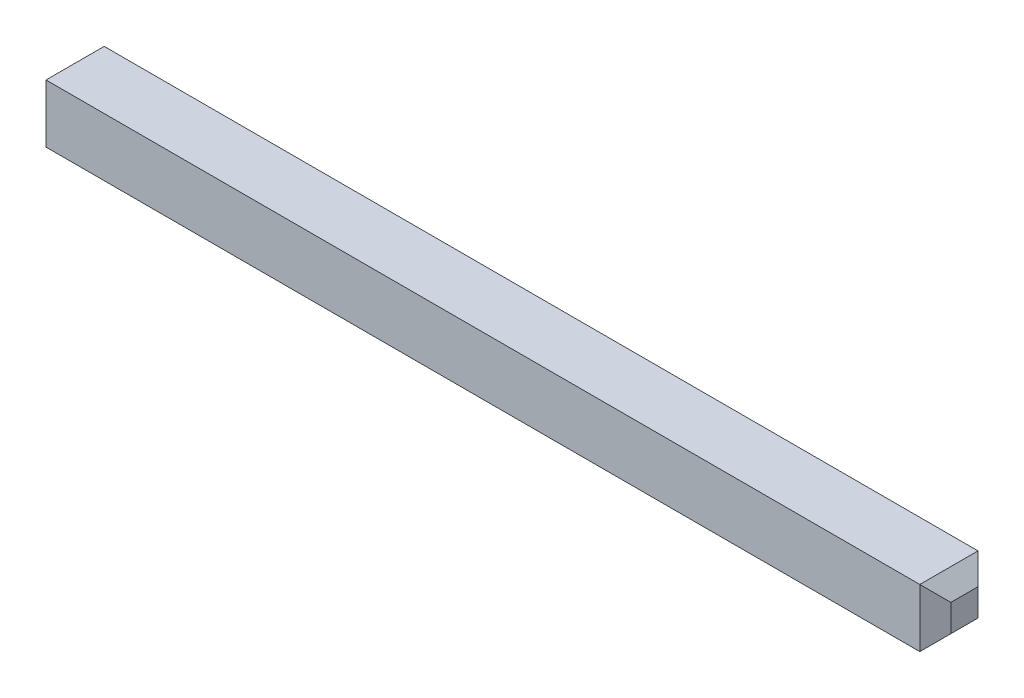
ISO-10303-21;
HEADER;
FILE_DESCRIPTION(('STEP AP214'),'2;1');
FILE_NAME('part.step','',(''),(''),'','','');
FILE_SCHEMA(('AUTOMOTIVE_DESIGN { 1 0 10303 214 1 1 1 1 }'));
ENDSEC;
DATA;
#1=APPLICATION_CONTEXT('core data for automotive mechanical design processes');
#2=APPLICATION_PROTOCOL_DEFINITION('international standard','automotive_design',2000,#1);
#3=PRODUCT_CONTEXT('',#1,'mechanical');
#4=PRODUCT('Part','Part','',(#3));
#5=PRODUCT_RELATED_PRODUCT_CATEGORY('part','',(#4));
#6=PRODUCT_DEFINITION_FORMATION('','',#4);
#7=PRODUCT_DEFINITION_CONTEXT('part definition',#1,'design');
#8=PRODUCT_DEFINITION('design','',#6,#7);
#9=PRODUCT_DEFINITION_SHAPE('','',#8);
#10=(LENGTH_UNIT() NAMED_UNIT(*) SI_UNIT(.MILLI.,.METRE.));
#11=(NAMED_UNIT(*) PLANE_ANGLE_UNIT() SI_UNIT($,.RADIAN.));
#12=(NAMED_UNIT(*) SI_UNIT($,.STERADIAN.) SOLID_ANGLE_UNIT());
#13=UNCERTAINTY_MEASURE_WITH_UNIT(LENGTH_MEASURE(1.E-05),#10,'distance_accuracy_value','');
#14=(GEOMETRIC_REPRESENTATION_CONTEXT(3) GLOBAL_UNCERTAINTY_ASSIGNED_CONTEXT((#13)) GLOBAL_UNIT_ASSIGNED_CONTEXT((#10,
#11,#12)) REPRESENTATION_CONTEXT('',''));
#15=CARTESIAN_POINT('',(0.,0.,0.));
#16=DIRECTION('',(0.,0.,1.));
#17=DIRECTION('',(1.,0.,0.));
#18=AXIS2_PLACEMENT_3D('',#15,#16,#17);
#19=CARTESIAN_POINT('',(24.94,3.165,-32.));
#20=DIRECTION('',(-0.707106781186548,-0.707106781186548,0.));
#21=DIRECTION('',(0.707106781186548,-0.707106781186548,0.));
#22=AXIS2_PLACEMENT_3D('',#19,#20,#21);
#23=PLANE('',#22);
#24=DIRECTION('',(0.,0.,1.));
#25=VECTOR('',#24,1.);
#26=CARTESIAN_POINT('',(25.,3.105,-32.225));
#27=LINE('',#26,#25);
#28=CARTESIAN_POINT('',(25.,3.105,-32.12));
#29=VERTEX_POINT('',#28);
#30=CARTESIAN_POINT('',(25.,3.105,-32.33));
#31=VERTEX_POINT('',#30);
#32=EDGE_CURVE('E19',#29,#31,#27,.F.);
#33=ORIENTED_EDGE('',*,*,#32,.T.);
#34=DIRECTION('',(-0.57735026918964,0.577350269189597,-0.57735026918964));
#35=VECTOR('',#34,1.);
#36=CARTESIAN_POINT('',(25.,3.105,-32.33));
#37=LINE('',#36,#35);
#38=CARTESIAN_POINT('',(24.88,3.225,-32.45));
#39=VERTEX_POINT('',#38);
#40=EDGE_CURVE('E82',#31,#39,#37,.T.);
#41=ORIENTED_EDGE('',*,*,#40,.T.);
#42=DIRECTION('',(0.,0.,1.));
#43=VECTOR('',#42,1.);
#44=CARTESIAN_POINT('',(24.88,3.225,-32.));
#45=LINE('',#44,#43);
#46=CARTESIAN_POINT('',(24.88,3.225,-32.));
#47=VERTEX_POINT('',#46);
#48=EDGE_CURVE('E103',#47,#39,#45,.F.);
#49=ORIENTED_EDGE('',*,*,#48,.F.);
#50=DIRECTION('',(0.577350269189629,-0.57735026918962,-0.577350269189629));
#51=VECTOR('',#50,1.);
#52=CARTESIAN_POINT('',(24.88,3.225,-32.));
#53=LINE('',#52,#51);
#54=EDGE_CURVE('E78',#47,#29,#53,.T.);
#55=ORIENTED_EDGE('',*,*,#54,.T.);
#56=EDGE_LOOP('',(#33,#41,#49,#55));
#57=FACE_BOUND('',#56,.T.);
#58=ADVANCED_FACE('F16',(#57),#23,.F.);
#59=CARTESIAN_POINT('',(18.06,3.165,-32.));
#60=DIRECTION('',(-0.707106781186548,0.707106781186548,0.));
#61=DIRECTION('',(-0.707106781186548,-0.707106781186548,0.));
#62=AXIS2_PLACEMENT_3D('',#59,#60,#61);
#63=PLANE('',#62);
#64=DIRECTION('',(0.57735026918964,0.577350269189597,-0.57735026918964));
#65=VECTOR('',#64,1.);
#66=CARTESIAN_POINT('',(18.,3.105,-32.33));
#67=LINE('',#66,#65);
#68=CARTESIAN_POINT('',(18.,3.105,-32.33));
#69=VERTEX_POINT('',#68);
#70=CARTESIAN_POINT('',(18.12,3.225,-32.45));
#71=VERTEX_POINT('',#70);
#72=EDGE_CURVE('E108',#69,#71,#67,.T.);
#73=ORIENTED_EDGE('',*,*,#72,.F.);
#74=DIRECTION('',(0.,0.,1.));
#75=VECTOR('',#74,1.);
#76=CARTESIAN_POINT('',(18.,3.105,-32.225));
#77=LINE('',#76,#75);
#78=CARTESIAN_POINT('',(18.,3.105,-32.12));
#79=VERTEX_POINT('',#78);
#80=EDGE_CURVE('E116',#79,#69,#77,.F.);
#81=ORIENTED_EDGE('',*,*,#80,.F.);
#82=DIRECTION('',(-0.577350269189629,-0.577350269189637,-0.577350269189612));
#83=VECTOR('',#82,1.);
#84=CARTESIAN_POINT('',(18.12,3.225,-32.));
#85=LINE('',#84,#83);
#86=CARTESIAN_POINT('',(18.12,3.225,-32.));
#87=VERTEX_POINT('',#86);
#88=EDGE_CURVE('E111',#87,#79,#85,.T.);
#89=ORIENTED_EDGE('',*,*,#88,.F.);
#90=DIRECTION('',(0.,0.,1.));
#91=VECTOR('',#90,1.);
#92=CARTESIAN_POINT('',(18.12,3.225,-32.));
#93=LINE('',#92,#91);
#94=EDGE_CURVE('E105',#71,#87,#93,.T.);
#95=ORIENTED_EDGE('',*,*,#94,.F.);
#96=EDGE_LOOP('',(#73,#81,#89,#95));
#97=FACE_BOUND('',#96,.T.);
#98=ADVANCED_FACE('F175',(#97),#63,.T.);
#99=CARTESIAN_POINT('',(25.,3.,-32.225));
#100=DIRECTION('',(-1.,0.,0.));
#101=DIRECTION('',(0.,0.,1.));
#102=AXIS2_PLACEMENT_3D('',#99,#100,#101);
#103=PLANE('',#102);
#104=DIRECTION('',(0.,0.,1.));
#105=VECTOR('',#104,1.);
#106=CARTESIAN_POINT('',(25.,2.895,-32.45));
#107=LINE('',#106,#105);
#108=CARTESIAN_POINT('',(25.,2.895,-32.12));
#109=VERTEX_POINT('',#108);
#110=CARTESIAN_POINT('',(25.,2.895,-32.33));
#111=VERTEX_POINT('',#110);
#112=EDGE_CURVE('E90',#109,#111,#107,.F.);
#113=ORIENTED_EDGE('',*,*,#112,.T.);
#114=DIRECTION('',(0.,1.,0.));
#115=VECTOR('',#114,1.);
#116=CARTESIAN_POINT('',(25.,3.225,-32.33));
#117=LINE('',#116,#115);
#118=EDGE_CURVE('E86',#111,#31,#117,.T.);
#119=ORIENTED_EDGE('',*,*,#118,.T.);
#120=ORIENTED_EDGE('',*,*,#32,.F.);
#121=DIRECTION('',(0.,1.,0.));
#122=VECTOR('',#121,1.);
#123=CARTESIAN_POINT('',(25.,2.775,-32.12));
#124=LINE('',#123,#122);
#125=EDGE_CURVE('E99',#29,#109,#124,.F.);
#126=ORIENTED_EDGE('',*,*,#125,.T.);
#127=EDGE_LOOP('',(#113,#119,#120,#126));
#128=FACE_BOUND('',#127,.T.);
#129=ADVANCED_FACE('F88',(#128),#103,.F.);
#130=CARTESIAN_POINT('',(24.94,3.225,-32.39));
#131=DIRECTION('',(-0.707106781186548,0.,0.707106781186548));
#132=DIRECTION('',(0.707106781186548,0.,0.707106781186548));
#133=AXIS2_PLACEMENT_3D('',#130,#131,#132);
#134=PLANE('',#133);
#135=ORIENTED_EDGE('',*,*,#118,.F.);
#136=DIRECTION('',(-0.577350269189615,-0.577350269189615,-0.577350269189648));
#137=VECTOR('',#136,1.);
#138=CARTESIAN_POINT('',(25.,2.895,-32.33));
#139=LINE('',#138,#137);
#140=CARTESIAN_POINT('',(24.88,2.775,-32.45));
#141=VERTEX_POINT('',#140);
#142=EDGE_CURVE('E132',#111,#141,#139,.T.);
#143=ORIENTED_EDGE('',*,*,#142,.T.);
#144=DIRECTION('',(0.,1.,0.));
#145=VECTOR('',#144,1.);
#146=CARTESIAN_POINT('',(24.88,3.225,-32.45));
#147=LINE('',#146,#145);
#148=EDGE_CURVE('E96',#39,#141,#147,.F.);
#149=ORIENTED_EDGE('',*,*,#148,.F.);
#150=ORIENTED_EDGE('',*,*,#40,.F.);
#151=EDGE_LOOP('',(#135,#143,#149,#150));
#152=FACE_BOUND('',#151,.T.);
#153=ADVANCED_FACE('F94',(#152),#134,.F.);
#154=CARTESIAN_POINT('',(24.94,2.775,-32.06));
#155=DIRECTION('',(-0.707106781186548,0.,-0.707106781186548));
#156=DIRECTION('',(-0.707106781186548,0.,0.707106781186548));
#157=AXIS2_PLACEMENT_3D('',#154,#155,#156);
#158=PLANE('',#157);
#159=ORIENTED_EDGE('',*,*,#125,.F.);
#160=ORIENTED_EDGE('',*,*,#54,.F.);
#161=DIRECTION('',(0.,1.,0.));
#162=VECTOR('',#161,1.);
#163=CARTESIAN_POINT('',(24.88,2.775,-32.));
#164=LINE('',#163,#162);
#165=CARTESIAN_POINT('',(24.88,2.775,-32.));
#166=VERTEX_POINT('',#165);
#167=EDGE_CURVE('E134',#166,#47,#164,.T.);
#168=ORIENTED_EDGE('',*,*,#167,.F.);
#169=DIRECTION('',(0.577350269189637,0.577350269189637,-0.577350269189604));
#170=VECTOR('',#169,1.);
#171=CARTESIAN_POINT('',(24.88,2.775,-32.));
#172=LINE('',#171,#170);
#173=EDGE_CURVE('E128',#166,#109,#172,.T.);
#174=ORIENTED_EDGE('',*,*,#173,.T.);
#175=EDGE_LOOP('',(#159,#160,#168,#174));
#176=FACE_BOUND('',#175,.T.);
#177=ADVANCED_FACE('F183',(#176),#158,.F.);
#178=CARTESIAN_POINT('',(18.,3.225,-32.));
#179=DIRECTION('',(0.,1.,0.));
#180=DIRECTION('',(0.,0.,1.));
#181=AXIS2_PLACEMENT_3D('',#178,#179,#180);
#182=PLANE('',#181);
#183=DIRECTION('',(-1.,0.,0.));
#184=VECTOR('',#183,1.);
#185=CARTESIAN_POINT('',(18.,3.225,-32.45));
#186=LINE('',#185,#184);
#187=EDGE_CURVE('E122',#71,#39,#186,.F.);
#188=ORIENTED_EDGE('',*,*,#187,.F.);
#189=ORIENTED_EDGE('',*,*,#94,.T.);
#190=DIRECTION('',(1.,0.,0.));
#191=VECTOR('',#190,1.);
#192=CARTESIAN_POINT('',(18.,3.225,-32.));
#193=LINE('',#192,#191);
#194=EDGE_CURVE('E137',#47,#87,#193,.F.);
#195=ORIENTED_EDGE('',*,*,#194,.F.);
#196=ORIENTED_EDGE('',*,*,#48,.T.);
#197=EDGE_LOOP('',(#188,#189,#195,#196));
#198=FACE_BOUND('',#197,.T.);
#199=ADVANCED_FACE('F185',(#198),#182,.T.);
#200=CARTESIAN_POINT('',(18.06,3.225,-32.39));
#201=DIRECTION('',(-0.707106781186548,0.,-0.707106781186548));
#202=DIRECTION('',(-0.707106781186548,0.,0.707106781186548));
#203=AXIS2_PLACEMENT_3D('',#200,#201,#202);
#204=PLANE('',#203);
#205=DIRECTION('',(0.577350269189608,-0.577350269189612,-0.577350269189658));
#206=VECTOR('',#205,1.);
#207=CARTESIAN_POINT('',(18.,2.895,-32.33));
#208=LINE('',#207,#206);
#209=CARTESIAN_POINT('',(18.,2.895,-32.33));
#210=VERTEX_POINT('',#209);
#211=CARTESIAN_POINT('',(18.12,2.775,-32.45));
#212=VERTEX_POINT('',#211);
#213=EDGE_CURVE('E142',#210,#212,#208,.T.);
#214=ORIENTED_EDGE('',*,*,#213,.F.);
#215=DIRECTION('',(0.,1.,0.));
#216=VECTOR('',#215,1.);
#217=CARTESIAN_POINT('',(18.,3.,-32.33));
#218=LINE('',#217,#216);
#219=EDGE_CURVE('E119',#69,#210,#218,.F.);
#220=ORIENTED_EDGE('',*,*,#219,.F.);
#221=ORIENTED_EDGE('',*,*,#72,.T.);
#222=DIRECTION('',(0.,1.,0.));
#223=VECTOR('',#222,1.);
#224=CARTESIAN_POINT('',(18.12,3.225,-32.45));
#225=LINE('',#224,#223);
#226=EDGE_CURVE('E125',#212,#71,#225,.T.);
#227=ORIENTED_EDGE('',*,*,#226,.F.);
#228=EDGE_LOOP('',(#214,#220,#221,#227));
#229=FACE_BOUND('',#228,.T.);
#230=ADVANCED_FACE('F169',(#229),#204,.T.);
#231=CARTESIAN_POINT('',(18.06,2.775,-32.06));
#232=DIRECTION('',(-0.707106781186548,0.,0.707106781186548));
#233=DIRECTION('',(0.707106781186548,0.,0.707106781186548));
#234=AXIS2_PLACEMENT_3D('',#231,#232,#233);
#235=PLANE('',#234);
#236=ORIENTED_EDGE('',*,*,#88,.T.);
#237=DIRECTION('',(0.,1.,0.));
#238=VECTOR('',#237,1.);
#239=CARTESIAN_POINT('',(18.,3.,-32.12));
#240=LINE('',#239,#238);
#241=CARTESIAN_POINT('',(18.,2.895,-32.12));
#242=VERTEX_POINT('',#241);
#243=EDGE_CURVE('E113',#242,#79,#240,.T.);
#244=ORIENTED_EDGE('',*,*,#243,.F.);
#245=DIRECTION('',(-0.57735026918963,0.577350269189634,-0.577350269189613));
#246=VECTOR('',#245,1.);
#247=CARTESIAN_POINT('',(18.12,2.775,-32.));
#248=LINE('',#247,#246);
#249=CARTESIAN_POINT('',(18.12,2.775,-32.));
#250=VERTEX_POINT('',#249);
#251=EDGE_CURVE('E34',#250,#242,#248,.T.);
#252=ORIENTED_EDGE('',*,*,#251,.F.);
#253=DIRECTION('',(0.,1.,0.));
#254=VECTOR('',#253,1.);
#255=CARTESIAN_POINT('',(18.12,2.775,-32.));
#256=LINE('',#255,#254);
#257=EDGE_CURVE('E140',#87,#250,#256,.F.);
#258=ORIENTED_EDGE('',*,*,#257,.F.);
#259=EDGE_LOOP('',(#236,#244,#252,#258));
#260=FACE_BOUND('',#259,.T.);
#261=ADVANCED_FACE('F193',(#260),#235,.T.);
#262=CARTESIAN_POINT('',(18.,3.,-32.225));
#263=DIRECTION('',(-1.,0.,0.));
#264=DIRECTION('',(0.,0.,1.));
#265=AXIS2_PLACEMENT_3D('',#262,#263,#264);
#266=PLANE('',#265);
#267=ORIENTED_EDGE('',*,*,#219,.T.);
#268=DIRECTION('',(0.,0.,1.));
#269=VECTOR('',#268,1.);
#270=CARTESIAN_POINT('',(18.,2.895,-32.45));
#271=LINE('',#270,#269);
#272=EDGE_CURVE('E146',#242,#210,#271,.F.);
#273=ORIENTED_EDGE('',*,*,#272,.F.);
#274=ORIENTED_EDGE('',*,*,#243,.T.);
#275=ORIENTED_EDGE('',*,*,#80,.T.);
#276=EDGE_LOOP('',(#267,#273,#274,#275));
#277=FACE_BOUND('',#276,.T.);
#278=ADVANCED_FACE('F172',(#277),#266,.T.);
#279=CARTESIAN_POINT('',(18.,3.225,-32.45));
#280=DIRECTION('',(0.,0.,-1.));
#281=DIRECTION('',(-1.,0.,0.));
#282=AXIS2_PLACEMENT_3D('',#279,#280,#281);
#283=PLANE('',#282);
#284=DIRECTION('',(1.,0.,0.));
#285=VECTOR('',#284,1.);
#286=CARTESIAN_POINT('',(18.,2.775,-32.45));
#287=LINE('',#286,#285);
#288=EDGE_CURVE('E149',#212,#141,#287,.T.);
#289=ORIENTED_EDGE('',*,*,#288,.F.);
#290=ORIENTED_EDGE('',*,*,#226,.T.);
#291=ORIENTED_EDGE('',*,*,#187,.T.);
#292=ORIENTED_EDGE('',*,*,#148,.T.);
#293=EDGE_LOOP('',(#289,#290,#291,#292));
#294=FACE_BOUND('',#293,.T.);
#295=ADVANCED_FACE('F178',(#294),#283,.T.);
#296=CARTESIAN_POINT('',(24.94,2.835,-32.45));
#297=DIRECTION('',(-0.707106781186548,0.707106781186548,0.));
#298=DIRECTION('',(-0.707106781186548,-0.707106781186548,0.));
#299=AXIS2_PLACEMENT_3D('',#296,#297,#298);
#300=PLANE('',#299);
#301=ORIENTED_EDGE('',*,*,#112,.F.);
#302=ORIENTED_EDGE('',*,*,#173,.F.);
#303=DIRECTION('',(0.,0.,-1.));
#304=VECTOR('',#303,1.);
#305=CARTESIAN_POINT('',(24.88,2.775,-32.45));
#306=LINE('',#305,#304);
#307=EDGE_CURVE('E152',#141,#166,#306,.F.);
#308=ORIENTED_EDGE('',*,*,#307,.F.);
#309=ORIENTED_EDGE('',*,*,#142,.F.);
#310=EDGE_LOOP('',(#301,#302,#308,#309));
#311=FACE_BOUND('',#310,.T.);
#312=ADVANCED_FACE('F181',(#311),#300,.F.);
#313=CARTESIAN_POINT('',(18.,2.775,-32.));
#314=DIRECTION('',(0.,0.,1.));
#315=DIRECTION('',(1.,0.,0.));
#316=AXIS2_PLACEMENT_3D('',#313,#314,#315);
#317=PLANE('',#316);
#318=ORIENTED_EDGE('',*,*,#194,.T.);
#319=ORIENTED_EDGE('',*,*,#257,.T.);
#320=DIRECTION('',(1.,0.,0.));
#321=VECTOR('',#320,1.);
#322=CARTESIAN_POINT('',(18.,2.775,-32.));
#323=LINE('',#322,#321);
#324=EDGE_CURVE('E25',#166,#250,#323,.F.);
#325=ORIENTED_EDGE('',*,*,#324,.F.);
#326=ORIENTED_EDGE('',*,*,#167,.T.);
#327=EDGE_LOOP('',(#318,#319,#325,#326));
#328=FACE_BOUND('',#327,.T.);
#329=ADVANCED_FACE('F162',(#328),#317,.T.);
#330=CARTESIAN_POINT('',(18.06,2.835,-32.45));
#331=DIRECTION('',(-0.707106781186548,-0.707106781186548,0.));
#332=DIRECTION('',(0.707106781186548,-0.707106781186548,0.));
#333=AXIS2_PLACEMENT_3D('',#330,#331,#332);
#334=PLANE('',#333);
#335=ORIENTED_EDGE('',*,*,#251,.T.);
#336=ORIENTED_EDGE('',*,*,#272,.T.);
#337=ORIENTED_EDGE('',*,*,#213,.T.);
#338=DIRECTION('',(0.,0.,-1.));
#339=VECTOR('',#338,1.);
#340=CARTESIAN_POINT('',(18.12,2.775,-32.45));
#341=LINE('',#340,#339);
#342=EDGE_CURVE('E11',#250,#212,#341,.T.);
#343=ORIENTED_EDGE('',*,*,#342,.F.);
#344=EDGE_LOOP('',(#335,#336,#337,#343));
#345=FACE_BOUND('',#344,.T.);
#346=ADVANCED_FACE('F165',(#345),#334,.T.);
#347=CARTESIAN_POINT('',(18.,2.775,-32.45));
#348=DIRECTION('',(0.,-1.,0.));
#349=DIRECTION('',(0.,0.,-1.));
#350=AXIS2_PLACEMENT_3D('',#347,#348,#349);
#351=PLANE('',#350);
#352=ORIENTED_EDGE('',*,*,#324,.T.);
#353=ORIENTED_EDGE('',*,*,#342,.T.);
#354=ORIENTED_EDGE('',*,*,#288,.T.);
#355=ORIENTED_EDGE('',*,*,#307,.T.);
#356=EDGE_LOOP('',(#352,#353,#354,#355));
#357=FACE_BOUND('',#356,.T.);
#358=ADVANCED_FACE('F158',(#357),#351,.T.);
#359=CLOSED_SHELL('',(#58,#98,#129,#153,#177,#199,#230,#261,#278,#295,#312,#329,#346,#358));
#360=MANIFOLD_SOLID_BREP('B1',#359);
#361=ADVANCED_BREP_SHAPE_REPRESENTATION('',(#18,#360),#14);
#362=SHAPE_DEFINITION_REPRESENTATION(#9,#361);
ENDSEC;
END-ISO-10303-21;
